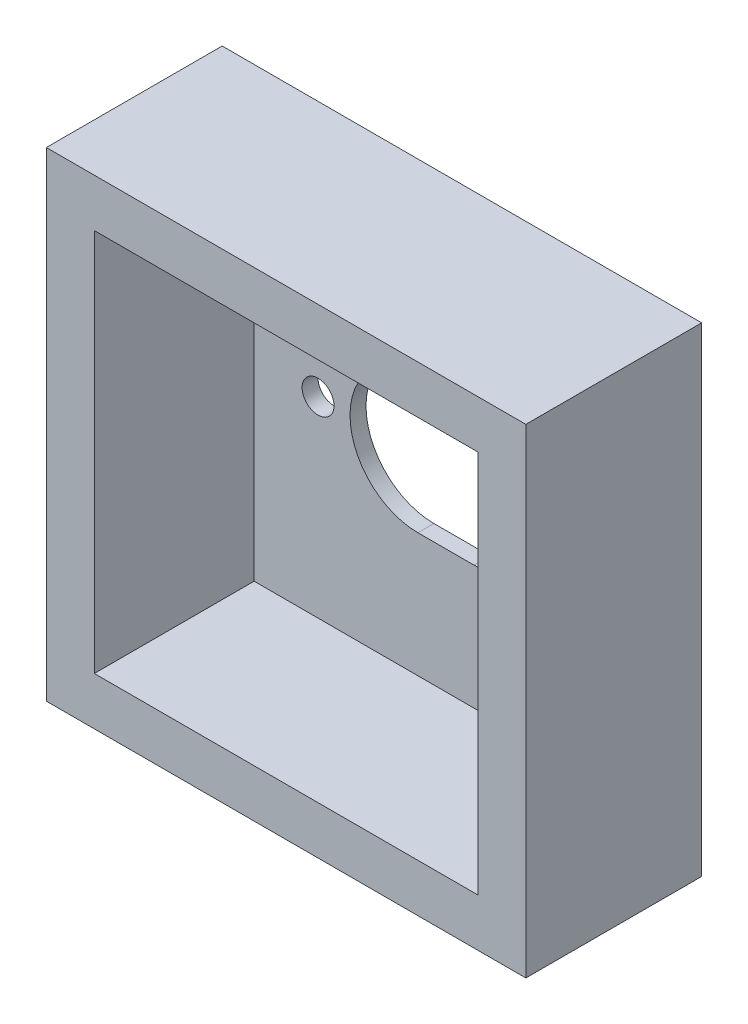
ISO-10303-21;
HEADER;
FILE_DESCRIPTION(('STEP AP214'),'2;1');
FILE_NAME('part.step','',(''),(''),'','','');
FILE_SCHEMA(('AUTOMOTIVE_DESIGN { 1 0 10303 214 1 1 1 1 }'));
ENDSEC;
DATA;
#1=APPLICATION_CONTEXT('core data for automotive mechanical design processes');
#2=APPLICATION_PROTOCOL_DEFINITION('international standard','automotive_design',2000,#1);
#3=PRODUCT_CONTEXT('',#1,'mechanical');
#4=PRODUCT('Part','Part','',(#3));
#5=PRODUCT_RELATED_PRODUCT_CATEGORY('part','',(#4));
#6=PRODUCT_DEFINITION_FORMATION('','',#4);
#7=PRODUCT_DEFINITION_CONTEXT('part definition',#1,'design');
#8=PRODUCT_DEFINITION('design','',#6,#7);
#9=PRODUCT_DEFINITION_SHAPE('','',#8);
#10=(LENGTH_UNIT() NAMED_UNIT(*) SI_UNIT(.MILLI.,.METRE.));
#11=(NAMED_UNIT(*) PLANE_ANGLE_UNIT() SI_UNIT($,.RADIAN.));
#12=(NAMED_UNIT(*) SI_UNIT($,.STERADIAN.) SOLID_ANGLE_UNIT());
#13=UNCERTAINTY_MEASURE_WITH_UNIT(LENGTH_MEASURE(1.E-05),#10,'distance_accuracy_value','');
#14=(GEOMETRIC_REPRESENTATION_CONTEXT(3) GLOBAL_UNCERTAINTY_ASSIGNED_CONTEXT((#13)) GLOBAL_UNIT_ASSIGNED_CONTEXT((#10,
#11,#12)) REPRESENTATION_CONTEXT('',''));
#15=CARTESIAN_POINT('',(0.,0.,0.));
#16=DIRECTION('',(0.,0.,1.));
#17=DIRECTION('',(1.,0.,0.));
#18=AXIS2_PLACEMENT_3D('',#15,#16,#17);
#19=CARTESIAN_POINT('',(0.,0.,0.6));
#20=DIRECTION('',(0.,0.,1.));
#21=DIRECTION('',(1.,0.,0.));
#22=AXIS2_PLACEMENT_3D('',#19,#20,#21);
#23=PLANE('',#22);
#24=CARTESIAN_POINT('',(-1.75,0.,0.6));
#25=DIRECTION('',(0.,0.,1.));
#26=DIRECTION('',(1.,0.,0.));
#27=AXIS2_PLACEMENT_3D('',#24,#25,#26);
#28=CIRCLE('',#27,4.25);
#29=CARTESIAN_POINT('',(-1.75,4.25,0.6));
#30=VERTEX_POINT('',#29);
#31=CARTESIAN_POINT('',(-1.75,-4.25,0.6));
#32=VERTEX_POINT('',#31);
#33=EDGE_CURVE('E192',#30,#32,#28,.T.);
#34=ORIENTED_EDGE('',*,*,#33,.F.);
#35=DIRECTION('',(-1.,0.,0.));
#36=VECTOR('',#35,1.);
#37=CARTESIAN_POINT('',(-1.75,4.25,0.6));
#38=LINE('',#37,#36);
#39=CARTESIAN_POINT('',(1.75,4.25,0.6));
#40=VERTEX_POINT('',#39);
#41=EDGE_CURVE('E196',#40,#30,#38,.T.);
#42=ORIENTED_EDGE('',*,*,#41,.F.);
#43=CARTESIAN_POINT('',(1.75,0.,0.6));
#44=DIRECTION('',(0.,0.,1.));
#45=DIRECTION('',(1.,0.,0.));
#46=AXIS2_PLACEMENT_3D('',#43,#44,#45);
#47=CIRCLE('',#46,4.25);
#48=CARTESIAN_POINT('',(1.75000000000004,-4.25,0.6));
#49=VERTEX_POINT('',#48);
#50=EDGE_CURVE('E215',#49,#40,#47,.T.);
#51=ORIENTED_EDGE('',*,*,#50,.F.);
#52=DIRECTION('',(1.,0.,0.));
#53=VECTOR('',#52,1.);
#54=CARTESIAN_POINT('',(1.75000000000004,-4.25,0.6));
#55=LINE('',#54,#53);
#56=EDGE_CURVE('E209',#32,#49,#55,.T.);
#57=ORIENTED_EDGE('',*,*,#56,.F.);
#58=EDGE_LOOP('',(#34,#42,#51,#57));
#59=FACE_BOUND('',#58,.T.);
#60=CARTESIAN_POINT('',(-8.,0.,0.6));
#61=DIRECTION('',(0.,0.,1.));
#62=DIRECTION('',(1.,0.,0.));
#63=AXIS2_PLACEMENT_3D('',#60,#61,#62);
#64=CIRCLE('',#63,1.);
#65=CARTESIAN_POINT('',(-7.,0.,0.6));
#66=VERTEX_POINT('',#65);
#67=EDGE_CURVE('E190',#66,#66,#64,.T.);
#68=ORIENTED_EDGE('',*,*,#67,.F.);
#69=EDGE_LOOP('',(#68));
#70=FACE_BOUND('',#69,.T.);
#71=CARTESIAN_POINT('',(8.,0.,0.6));
#72=DIRECTION('',(0.,0.,1.));
#73=DIRECTION('',(1.,0.,0.));
#74=AXIS2_PLACEMENT_3D('',#71,#72,#73);
#75=CIRCLE('',#74,1.);
#76=CARTESIAN_POINT('',(9.,0.,0.6));
#77=VERTEX_POINT('',#76);
#78=EDGE_CURVE('E182',#77,#77,#75,.T.);
#79=ORIENTED_EDGE('',*,*,#78,.F.);
#80=EDGE_LOOP('',(#79));
#81=FACE_BOUND('',#80,.T.);
#82=DIRECTION('',(-1.,0.,0.));
#83=VECTOR('',#82,1.);
#84=CARTESIAN_POINT('',(-12.,12.,0.6));
#85=LINE('',#84,#83);
#86=CARTESIAN_POINT('',(12.,12.,0.6));
#87=VERTEX_POINT('',#86);
#88=CARTESIAN_POINT('',(-12.,12.,0.6));
#89=VERTEX_POINT('',#88);
#90=EDGE_CURVE('E142',#87,#89,#85,.T.);
#91=ORIENTED_EDGE('',*,*,#90,.T.);
#92=DIRECTION('',(0.,-1.,0.));
#93=VECTOR('',#92,1.);
#94=CARTESIAN_POINT('',(-12.,12.,0.6));
#95=LINE('',#94,#93);
#96=CARTESIAN_POINT('',(-12.,-12.,0.6));
#97=VERTEX_POINT('',#96);
#98=EDGE_CURVE('E159',#89,#97,#95,.T.);
#99=ORIENTED_EDGE('',*,*,#98,.T.);
#100=DIRECTION('',(1.,0.,0.));
#101=VECTOR('',#100,1.);
#102=CARTESIAN_POINT('',(-12.,-12.,0.6));
#103=LINE('',#102,#101);
#104=CARTESIAN_POINT('',(12.,-12.,0.6));
#105=VERTEX_POINT('',#104);
#106=EDGE_CURVE('E150',#97,#105,#103,.T.);
#107=ORIENTED_EDGE('',*,*,#106,.T.);
#108=DIRECTION('',(0.,1.,0.));
#109=VECTOR('',#108,1.);
#110=CARTESIAN_POINT('',(12.,12.,0.6));
#111=LINE('',#110,#109);
#112=EDGE_CURVE('E161',#105,#87,#111,.T.);
#113=ORIENTED_EDGE('',*,*,#112,.T.);
#114=EDGE_LOOP('',(#91,#99,#107,#113));
#115=FACE_BOUND('',#114,.T.);
#116=ADVANCED_FACE('F41',(#59,#70,#81,#115),#23,.T.);
#117=CARTESIAN_POINT('',(-15.,15.,-0.399999999999993));
#118=DIRECTION('',(-1.,0.,0.));
#119=DIRECTION('',(0.,-1.,0.));
#120=AXIS2_PLACEMENT_3D('',#117,#118,#119);
#121=PLANE('',#120);
#122=DIRECTION('',(0.,0.,1.));
#123=VECTOR('',#122,1.);
#124=CARTESIAN_POINT('',(-15.,-15.,-0.399999999999993));
#125=LINE('',#124,#123);
#126=CARTESIAN_POINT('',(-15.,-15.,-0.399999999999993));
#127=VERTEX_POINT('',#126);
#128=CARTESIAN_POINT('',(-15.,-15.,10.6));
#129=VERTEX_POINT('',#128);
#130=EDGE_CURVE('E44',#127,#129,#125,.T.);
#131=ORIENTED_EDGE('',*,*,#130,.T.);
#132=DIRECTION('',(0.,-1.,0.));
#133=VECTOR('',#132,1.);
#134=CARTESIAN_POINT('',(-15.,15.,10.6));
#135=LINE('',#134,#133);
#136=CARTESIAN_POINT('',(-15.,15.,10.6));
#137=VERTEX_POINT('',#136);
#138=EDGE_CURVE('E147',#137,#129,#135,.T.);
#139=ORIENTED_EDGE('',*,*,#138,.F.);
#140=DIRECTION('',(0.,0.,1.));
#141=VECTOR('',#140,1.);
#142=CARTESIAN_POINT('',(-15.,15.,-0.399999999999993));
#143=LINE('',#142,#141);
#144=CARTESIAN_POINT('',(-15.,15.,-0.399999999999993));
#145=VERTEX_POINT('',#144);
#146=EDGE_CURVE('E11',#145,#137,#143,.T.);
#147=ORIENTED_EDGE('',*,*,#146,.F.);
#148=DIRECTION('',(0.,-1.,0.));
#149=VECTOR('',#148,1.);
#150=CARTESIAN_POINT('',(-15.,15.,-0.399999999999993));
#151=LINE('',#150,#149);
#152=EDGE_CURVE('E220',#145,#127,#151,.T.);
#153=ORIENTED_EDGE('',*,*,#152,.T.);
#154=EDGE_LOOP('',(#131,#139,#147,#153));
#155=FACE_BOUND('',#154,.T.);
#156=ADVANCED_FACE('F43',(#155),#121,.T.);
#157=CARTESIAN_POINT('',(-15.,15.,-0.399999999999993));
#158=DIRECTION('',(0.,1.,0.));
#159=DIRECTION('',(0.,0.,1.));
#160=AXIS2_PLACEMENT_3D('',#157,#158,#159);
#161=PLANE('',#160);
#162=ORIENTED_EDGE('',*,*,#146,.T.);
#163=DIRECTION('',(-1.,0.,0.));
#164=VECTOR('',#163,1.);
#165=CARTESIAN_POINT('',(-15.,15.,10.6));
#166=LINE('',#165,#164);
#167=CARTESIAN_POINT('',(15.,15.,10.6));
#168=VERTEX_POINT('',#167);
#169=EDGE_CURVE('E179',#168,#137,#166,.T.);
#170=ORIENTED_EDGE('',*,*,#169,.F.);
#171=DIRECTION('',(0.,0.,1.));
#172=VECTOR('',#171,1.);
#173=CARTESIAN_POINT('',(15.,15.,-0.399999999999993));
#174=LINE('',#173,#172);
#175=CARTESIAN_POINT('',(15.,15.,-0.399999999999993));
#176=VERTEX_POINT('',#175);
#177=EDGE_CURVE('E49',#176,#168,#174,.T.);
#178=ORIENTED_EDGE('',*,*,#177,.F.);
#179=DIRECTION('',(-1.,0.,0.));
#180=VECTOR('',#179,1.);
#181=CARTESIAN_POINT('',(-15.,15.,-0.399999999999993));
#182=LINE('',#181,#180);
#183=EDGE_CURVE('E234',#176,#145,#182,.T.);
#184=ORIENTED_EDGE('',*,*,#183,.T.);
#185=EDGE_LOOP('',(#162,#170,#178,#184));
#186=FACE_BOUND('',#185,.T.);
#187=ADVANCED_FACE('F248',(#186),#161,.T.);
#188=CARTESIAN_POINT('',(15.,15.,-0.399999999999993));
#189=DIRECTION('',(1.,0.,0.));
#190=DIRECTION('',(0.,0.,-1.));
#191=AXIS2_PLACEMENT_3D('',#188,#189,#190);
#192=PLANE('',#191);
#193=ORIENTED_EDGE('',*,*,#177,.T.);
#194=DIRECTION('',(0.,1.,0.));
#195=VECTOR('',#194,1.);
#196=CARTESIAN_POINT('',(15.,15.,10.6));
#197=LINE('',#196,#195);
#198=CARTESIAN_POINT('',(15.,-15.,10.6));
#199=VERTEX_POINT('',#198);
#200=EDGE_CURVE('E180',#199,#168,#197,.T.);
#201=ORIENTED_EDGE('',*,*,#200,.F.);
#202=DIRECTION('',(0.,0.,1.));
#203=VECTOR('',#202,1.);
#204=CARTESIAN_POINT('',(15.,-15.,-0.399999999999993));
#205=LINE('',#204,#203);
#206=CARTESIAN_POINT('',(15.,-15.,-0.399999999999993));
#207=VERTEX_POINT('',#206);
#208=EDGE_CURVE('E240',#207,#199,#205,.T.);
#209=ORIENTED_EDGE('',*,*,#208,.F.);
#210=DIRECTION('',(0.,1.,0.));
#211=VECTOR('',#210,1.);
#212=CARTESIAN_POINT('',(15.,15.,-0.399999999999993));
#213=LINE('',#212,#211);
#214=EDGE_CURVE('E233',#207,#176,#213,.T.);
#215=ORIENTED_EDGE('',*,*,#214,.T.);
#216=EDGE_LOOP('',(#193,#201,#209,#215));
#217=FACE_BOUND('',#216,.T.);
#218=ADVANCED_FACE('F253',(#217),#192,.T.);
#219=CARTESIAN_POINT('',(-15.,-15.,-0.399999999999993));
#220=DIRECTION('',(0.,-1.,0.));
#221=DIRECTION('',(0.,0.,-1.));
#222=AXIS2_PLACEMENT_3D('',#219,#220,#221);
#223=PLANE('',#222);
#224=ORIENTED_EDGE('',*,*,#208,.T.);
#225=DIRECTION('',(1.,0.,0.));
#226=VECTOR('',#225,1.);
#227=CARTESIAN_POINT('',(-15.,-15.,10.6));
#228=LINE('',#227,#226);
#229=EDGE_CURVE('E172',#129,#199,#228,.T.);
#230=ORIENTED_EDGE('',*,*,#229,.F.);
#231=ORIENTED_EDGE('',*,*,#130,.F.);
#232=DIRECTION('',(1.,0.,0.));
#233=VECTOR('',#232,1.);
#234=CARTESIAN_POINT('',(-15.,-15.,-0.399999999999993));
#235=LINE('',#234,#233);
#236=EDGE_CURVE('E226',#127,#207,#235,.T.);
#237=ORIENTED_EDGE('',*,*,#236,.T.);
#238=EDGE_LOOP('',(#224,#230,#231,#237));
#239=FACE_BOUND('',#238,.T.);
#240=ADVANCED_FACE('F242',(#239),#223,.T.);
#241=CARTESIAN_POINT('',(0.,0.,-0.399999999999993));
#242=DIRECTION('',(0.,0.,1.));
#243=DIRECTION('',(1.,0.,0.));
#244=AXIS2_PLACEMENT_3D('',#241,#242,#243);
#245=PLANE('',#244);
#246=CARTESIAN_POINT('',(8.,0.,-0.399999999999993));
#247=DIRECTION('',(0.,0.,1.));
#248=DIRECTION('',(1.,0.,0.));
#249=AXIS2_PLACEMENT_3D('',#246,#247,#248);
#250=CIRCLE('',#249,1.);
#251=CARTESIAN_POINT('',(9.,0.,-0.399999999999993));
#252=VERTEX_POINT('',#251);
#253=EDGE_CURVE('E183',#252,#252,#250,.T.);
#254=ORIENTED_EDGE('',*,*,#253,.T.);
#255=EDGE_LOOP('',(#254));
#256=FACE_BOUND('',#255,.T.);
#257=CARTESIAN_POINT('',(-8.,0.,-0.399999999999993));
#258=DIRECTION('',(0.,0.,1.));
#259=DIRECTION('',(1.,0.,0.));
#260=AXIS2_PLACEMENT_3D('',#257,#258,#259);
#261=CIRCLE('',#260,1.);
#262=CARTESIAN_POINT('',(-7.,0.,-0.399999999999993));
#263=VERTEX_POINT('',#262);
#264=EDGE_CURVE('E188',#263,#263,#261,.T.);
#265=ORIENTED_EDGE('',*,*,#264,.T.);
#266=EDGE_LOOP('',(#265));
#267=FACE_BOUND('',#266,.T.);
#268=DIRECTION('',(-1.,0.,0.));
#269=VECTOR('',#268,1.);
#270=CARTESIAN_POINT('',(-1.75,4.25,-0.399999999999993));
#271=LINE('',#270,#269);
#272=CARTESIAN_POINT('',(1.75,4.25,-0.399999999999993));
#273=VERTEX_POINT('',#272);
#274=CARTESIAN_POINT('',(-1.75,4.25,-0.399999999999993));
#275=VERTEX_POINT('',#274);
#276=EDGE_CURVE('E205',#273,#275,#271,.T.);
#277=ORIENTED_EDGE('',*,*,#276,.T.);
#278=CARTESIAN_POINT('',(-1.75,0.,-0.399999999999993));
#279=DIRECTION('',(0.,0.,1.));
#280=DIRECTION('',(1.,0.,0.));
#281=AXIS2_PLACEMENT_3D('',#278,#279,#280);
#282=CIRCLE('',#281,4.25);
#283=CARTESIAN_POINT('',(-1.75,-4.25,-0.399999999999993));
#284=VERTEX_POINT('',#283);
#285=EDGE_CURVE('E198',#275,#284,#282,.T.);
#286=ORIENTED_EDGE('',*,*,#285,.T.);
#287=DIRECTION('',(1.,0.,0.));
#288=VECTOR('',#287,1.);
#289=CARTESIAN_POINT('',(1.75000000000004,-4.25,-0.399999999999993));
#290=LINE('',#289,#288);
#291=CARTESIAN_POINT('',(1.75000000000004,-4.25,-0.399999999999993));
#292=VERTEX_POINT('',#291);
#293=EDGE_CURVE('E200',#284,#292,#290,.T.);
#294=ORIENTED_EDGE('',*,*,#293,.T.);
#295=CARTESIAN_POINT('',(1.75,0.,-0.399999999999993));
#296=DIRECTION('',(0.,0.,1.));
#297=DIRECTION('',(1.,0.,0.));
#298=AXIS2_PLACEMENT_3D('',#295,#296,#297);
#299=CIRCLE('',#298,4.25);
#300=EDGE_CURVE('E68',#292,#273,#299,.T.);
#301=ORIENTED_EDGE('',*,*,#300,.T.);
#302=EDGE_LOOP('',(#277,#286,#294,#301));
#303=FACE_BOUND('',#302,.T.);
#304=ORIENTED_EDGE('',*,*,#152,.F.);
#305=ORIENTED_EDGE('',*,*,#183,.F.);
#306=ORIENTED_EDGE('',*,*,#214,.F.);
#307=ORIENTED_EDGE('',*,*,#236,.F.);
#308=EDGE_LOOP('',(#304,#305,#306,#307));
#309=FACE_BOUND('',#308,.T.);
#310=ADVANCED_FACE('F255',(#256,#267,#303,#309),#245,.F.);
#311=CARTESIAN_POINT('',(-1.75,0.,-0.399999999999993));
#312=DIRECTION('',(0.,0.,1.));
#313=DIRECTION('',(1.,0.,0.));
#314=AXIS2_PLACEMENT_3D('',#311,#312,#313);
#315=CYLINDRICAL_SURFACE('',#314,4.25);
#316=ORIENTED_EDGE('',*,*,#33,.T.);
#317=DIRECTION('',(0.,0.,1.));
#318=VECTOR('',#317,1.);
#319=CARTESIAN_POINT('',(-1.75,-4.25,-0.399999999999993));
#320=LINE('',#319,#318);
#321=EDGE_CURVE('E210',#284,#32,#320,.T.);
#322=ORIENTED_EDGE('',*,*,#321,.F.);
#323=ORIENTED_EDGE('',*,*,#285,.F.);
#324=DIRECTION('',(0.,0.,1.));
#325=VECTOR('',#324,1.);
#326=CARTESIAN_POINT('',(-1.75,4.25,-0.399999999999993));
#327=LINE('',#326,#325);
#328=EDGE_CURVE('E219',#275,#30,#327,.T.);
#329=ORIENTED_EDGE('',*,*,#328,.T.);
#330=EDGE_LOOP('',(#316,#322,#323,#329));
#331=FACE_BOUND('',#330,.T.);
#332=ADVANCED_FACE('F273',(#331),#315,.F.);
#333=CARTESIAN_POINT('',(-1.75,4.25,-0.399999999999993));
#334=DIRECTION('',(0.,1.,0.));
#335=DIRECTION('',(0.,0.,1.));
#336=AXIS2_PLACEMENT_3D('',#333,#334,#335);
#337=PLANE('',#336);
#338=ORIENTED_EDGE('',*,*,#41,.T.);
#339=ORIENTED_EDGE('',*,*,#328,.F.);
#340=ORIENTED_EDGE('',*,*,#276,.F.);
#341=DIRECTION('',(0.,0.,1.));
#342=VECTOR('',#341,1.);
#343=CARTESIAN_POINT('',(1.75,4.25,-0.399999999999993));
#344=LINE('',#343,#342);
#345=EDGE_CURVE('E216',#273,#40,#344,.T.);
#346=ORIENTED_EDGE('',*,*,#345,.T.);
#347=EDGE_LOOP('',(#338,#339,#340,#346));
#348=FACE_BOUND('',#347,.T.);
#349=ADVANCED_FACE('F278',(#348),#337,.F.);
#350=CARTESIAN_POINT('',(1.75,0.,-0.399999999999993));
#351=DIRECTION('',(0.,0.,1.));
#352=DIRECTION('',(1.,0.,0.));
#353=AXIS2_PLACEMENT_3D('',#350,#351,#352);
#354=CYLINDRICAL_SURFACE('',#353,4.25);
#355=ORIENTED_EDGE('',*,*,#50,.T.);
#356=ORIENTED_EDGE('',*,*,#345,.F.);
#357=ORIENTED_EDGE('',*,*,#300,.F.);
#358=DIRECTION('',(0.,0.,1.));
#359=VECTOR('',#358,1.);
#360=CARTESIAN_POINT('',(1.75000000000004,-4.25,-0.399999999999993));
#361=LINE('',#360,#359);
#362=EDGE_CURVE('E225',#292,#49,#361,.T.);
#363=ORIENTED_EDGE('',*,*,#362,.T.);
#364=EDGE_LOOP('',(#355,#356,#357,#363));
#365=FACE_BOUND('',#364,.T.);
#366=ADVANCED_FACE('F281',(#365),#354,.F.);
#367=CARTESIAN_POINT('',(1.75000000000004,-4.25,-0.399999999999993));
#368=DIRECTION('',(0.,-1.,0.));
#369=DIRECTION('',(0.,0.,-1.));
#370=AXIS2_PLACEMENT_3D('',#367,#368,#369);
#371=PLANE('',#370);
#372=ORIENTED_EDGE('',*,*,#56,.T.);
#373=ORIENTED_EDGE('',*,*,#362,.F.);
#374=ORIENTED_EDGE('',*,*,#293,.F.);
#375=ORIENTED_EDGE('',*,*,#321,.T.);
#376=EDGE_LOOP('',(#372,#373,#374,#375));
#377=FACE_BOUND('',#376,.T.);
#378=ADVANCED_FACE('F283',(#377),#371,.F.);
#379=CARTESIAN_POINT('',(-8.,0.,-0.399999999999993));
#380=DIRECTION('',(0.,0.,1.));
#381=DIRECTION('',(1.,0.,0.));
#382=AXIS2_PLACEMENT_3D('',#379,#380,#381);
#383=CYLINDRICAL_SURFACE('',#382,1.);
#384=ORIENTED_EDGE('',*,*,#264,.F.);
#385=EDGE_LOOP('',(#384));
#386=FACE_BOUND('',#385,.T.);
#387=ORIENTED_EDGE('',*,*,#67,.T.);
#388=EDGE_LOOP('',(#387));
#389=FACE_BOUND('',#388,.T.);
#390=ADVANCED_FACE('F285',(#386,#389),#383,.F.);
#391=CARTESIAN_POINT('',(8.,0.,-0.399999999999993));
#392=DIRECTION('',(0.,0.,1.));
#393=DIRECTION('',(1.,0.,0.));
#394=AXIS2_PLACEMENT_3D('',#391,#392,#393);
#395=CYLINDRICAL_SURFACE('',#394,1.);
#396=ORIENTED_EDGE('',*,*,#253,.F.);
#397=EDGE_LOOP('',(#396));
#398=FACE_BOUND('',#397,.T.);
#399=ORIENTED_EDGE('',*,*,#78,.T.);
#400=EDGE_LOOP('',(#399));
#401=FACE_BOUND('',#400,.T.);
#402=ADVANCED_FACE('F295',(#398,#401),#395,.F.);
#403=CARTESIAN_POINT('',(0.,0.,10.6));
#404=DIRECTION('',(0.,0.,1.));
#405=DIRECTION('',(1.,0.,0.));
#406=AXIS2_PLACEMENT_3D('',#403,#404,#405);
#407=PLANE('',#406);
#408=ORIENTED_EDGE('',*,*,#138,.T.);
#409=ORIENTED_EDGE('',*,*,#229,.T.);
#410=ORIENTED_EDGE('',*,*,#200,.T.);
#411=ORIENTED_EDGE('',*,*,#169,.T.);
#412=EDGE_LOOP('',(#408,#409,#410,#411));
#413=FACE_BOUND('',#412,.T.);
#414=DIRECTION('',(1.,0.,0.));
#415=VECTOR('',#414,1.);
#416=CARTESIAN_POINT('',(-12.,-12.,10.6));
#417=LINE('',#416,#415);
#418=CARTESIAN_POINT('',(-12.,-12.,10.6));
#419=VERTEX_POINT('',#418);
#420=CARTESIAN_POINT('',(12.,-12.,10.6));
#421=VERTEX_POINT('',#420);
#422=EDGE_CURVE('E136',#419,#421,#417,.T.);
#423=ORIENTED_EDGE('',*,*,#422,.F.);
#424=DIRECTION('',(0.,-1.,0.));
#425=VECTOR('',#424,1.);
#426=CARTESIAN_POINT('',(-12.,12.,10.6));
#427=LINE('',#426,#425);
#428=CARTESIAN_POINT('',(-12.,12.,10.6));
#429=VERTEX_POINT('',#428);
#430=EDGE_CURVE('E134',#429,#419,#427,.T.);
#431=ORIENTED_EDGE('',*,*,#430,.F.);
#432=DIRECTION('',(-1.,0.,0.));
#433=VECTOR('',#432,1.);
#434=CARTESIAN_POINT('',(-12.,12.,10.6));
#435=LINE('',#434,#433);
#436=CARTESIAN_POINT('',(12.,12.,10.6));
#437=VERTEX_POINT('',#436);
#438=EDGE_CURVE('E156',#437,#429,#435,.T.);
#439=ORIENTED_EDGE('',*,*,#438,.F.);
#440=DIRECTION('',(0.,1.,0.));
#441=VECTOR('',#440,1.);
#442=CARTESIAN_POINT('',(12.,12.,10.6));
#443=LINE('',#442,#441);
#444=EDGE_CURVE('E155',#421,#437,#443,.T.);
#445=ORIENTED_EDGE('',*,*,#444,.F.);
#446=EDGE_LOOP('',(#423,#431,#439,#445));
#447=FACE_BOUND('',#446,.T.);
#448=ADVANCED_FACE('F154',(#413,#447),#407,.T.);
#449=CARTESIAN_POINT('',(-12.,12.,10.6));
#450=DIRECTION('',(1.,0.,0.));
#451=DIRECTION('',(0.,1.,0.));
#452=AXIS2_PLACEMENT_3D('',#449,#450,#451);
#453=PLANE('',#452);
#454=ORIENTED_EDGE('',*,*,#98,.F.);
#455=DIRECTION('',(0.,0.,-1.));
#456=VECTOR('',#455,1.);
#457=CARTESIAN_POINT('',(-12.,12.,10.6));
#458=LINE('',#457,#456);
#459=EDGE_CURVE('E59',#429,#89,#458,.T.);
#460=ORIENTED_EDGE('',*,*,#459,.F.);
#461=ORIENTED_EDGE('',*,*,#430,.T.);
#462=DIRECTION('',(0.,0.,-1.));
#463=VECTOR('',#462,1.);
#464=CARTESIAN_POINT('',(-12.,-12.,10.6));
#465=LINE('',#464,#463);
#466=EDGE_CURVE('E131',#419,#97,#465,.T.);
#467=ORIENTED_EDGE('',*,*,#466,.T.);
#468=EDGE_LOOP('',(#454,#460,#461,#467));
#469=FACE_BOUND('',#468,.T.);
#470=ADVANCED_FACE('F135',(#469),#453,.T.);
#471=CARTESIAN_POINT('',(-12.,-12.,10.6));
#472=DIRECTION('',(0.,1.,0.));
#473=DIRECTION('',(0.,0.,1.));
#474=AXIS2_PLACEMENT_3D('',#471,#472,#473);
#475=PLANE('',#474);
#476=ORIENTED_EDGE('',*,*,#106,.F.);
#477=ORIENTED_EDGE('',*,*,#466,.F.);
#478=ORIENTED_EDGE('',*,*,#422,.T.);
#479=DIRECTION('',(0.,0.,-1.));
#480=VECTOR('',#479,1.);
#481=CARTESIAN_POINT('',(12.,-12.,10.6));
#482=LINE('',#481,#480);
#483=EDGE_CURVE('E148',#421,#105,#482,.T.);
#484=ORIENTED_EDGE('',*,*,#483,.T.);
#485=EDGE_LOOP('',(#476,#477,#478,#484));
#486=FACE_BOUND('',#485,.T.);
#487=ADVANCED_FACE('F144',(#486),#475,.T.);
#488=CARTESIAN_POINT('',(12.,12.,10.6));
#489=DIRECTION('',(-1.,0.,0.));
#490=DIRECTION('',(0.,-1.,0.));
#491=AXIS2_PLACEMENT_3D('',#488,#489,#490);
#492=PLANE('',#491);
#493=ORIENTED_EDGE('',*,*,#112,.F.);
#494=ORIENTED_EDGE('',*,*,#483,.F.);
#495=ORIENTED_EDGE('',*,*,#444,.T.);
#496=DIRECTION('',(0.,0.,-1.));
#497=VECTOR('',#496,1.);
#498=CARTESIAN_POINT('',(12.,12.,10.6));
#499=LINE('',#498,#497);
#500=EDGE_CURVE('E169',#437,#87,#499,.T.);
#501=ORIENTED_EDGE('',*,*,#500,.T.);
#502=EDGE_LOOP('',(#493,#494,#495,#501));
#503=FACE_BOUND('',#502,.T.);
#504=ADVANCED_FACE('F302',(#503),#492,.T.);
#505=CARTESIAN_POINT('',(-12.,12.,10.6));
#506=DIRECTION('',(0.,-1.,0.));
#507=DIRECTION('',(0.,0.,-1.));
#508=AXIS2_PLACEMENT_3D('',#505,#506,#507);
#509=PLANE('',#508);
#510=ORIENTED_EDGE('',*,*,#90,.F.);
#511=ORIENTED_EDGE('',*,*,#500,.F.);
#512=ORIENTED_EDGE('',*,*,#438,.T.);
#513=ORIENTED_EDGE('',*,*,#459,.T.);
#514=EDGE_LOOP('',(#510,#511,#512,#513));
#515=FACE_BOUND('',#514,.T.);
#516=ADVANCED_FACE('F310',(#515),#509,.T.);
#517=CLOSED_SHELL('',(#116,#156,#187,#218,#240,#310,#332,#349,#366,#378,#390,#402,#448,#470,
#487,#504,#516));
#518=MANIFOLD_SOLID_BREP('B2',#517);
#519=ADVANCED_BREP_SHAPE_REPRESENTATION('',(#18,#518),#14);
#520=SHAPE_DEFINITION_REPRESENTATION(#9,#519);
ENDSEC;
END-ISO-10303-21;
